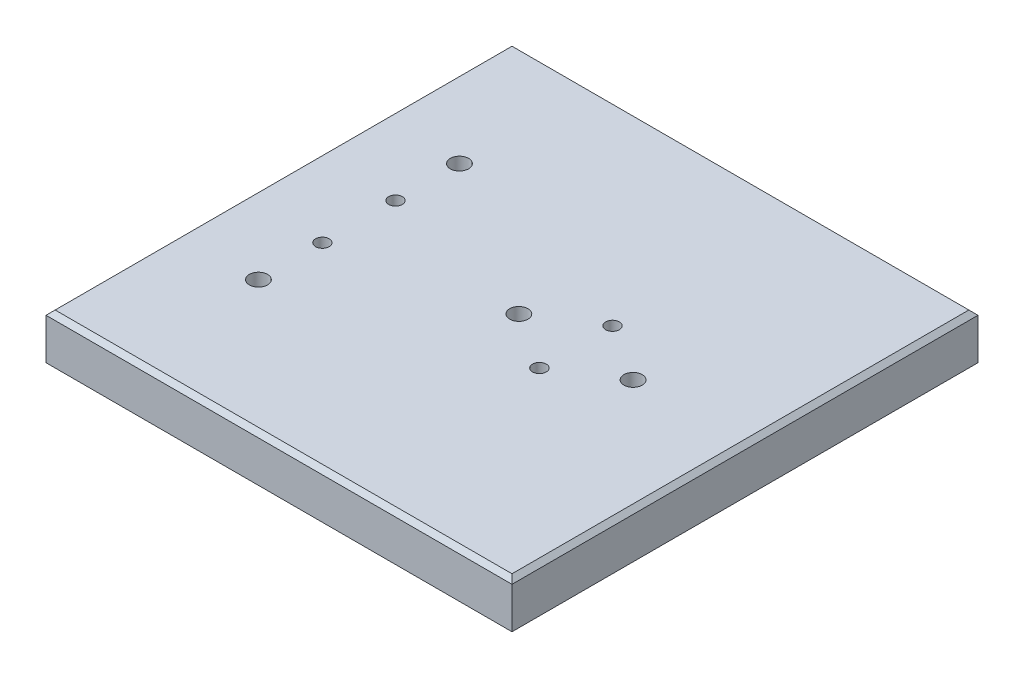
ISO-10303-21;
HEADER;
FILE_DESCRIPTION(('STEP AP214'),'2;1');
FILE_NAME('part.step','',(''),(''),'','','');
FILE_SCHEMA(('AUTOMOTIVE_DESIGN { 1 0 10303 214 1 1 1 1 }'));
ENDSEC;
DATA;
#1=APPLICATION_CONTEXT('core data for automotive mechanical design processes');
#2=APPLICATION_PROTOCOL_DEFINITION('international standard','automotive_design',2000,#1);
#3=PRODUCT_CONTEXT('',#1,'mechanical');
#4=PRODUCT('Part','Part','',(#3));
#5=PRODUCT_RELATED_PRODUCT_CATEGORY('part','',(#4));
#6=PRODUCT_DEFINITION_FORMATION('','',#4);
#7=PRODUCT_DEFINITION_CONTEXT('part definition',#1,'design');
#8=PRODUCT_DEFINITION('design','',#6,#7);
#9=PRODUCT_DEFINITION_SHAPE('','',#8);
#10=(LENGTH_UNIT() NAMED_UNIT(*) SI_UNIT(.MILLI.,.METRE.));
#11=(NAMED_UNIT(*) PLANE_ANGLE_UNIT() SI_UNIT($,.RADIAN.));
#12=(NAMED_UNIT(*) SI_UNIT($,.STERADIAN.) SOLID_ANGLE_UNIT());
#13=UNCERTAINTY_MEASURE_WITH_UNIT(LENGTH_MEASURE(1.E-05),#10,'distance_accuracy_value','');
#14=(GEOMETRIC_REPRESENTATION_CONTEXT(3) GLOBAL_UNCERTAINTY_ASSIGNED_CONTEXT((#13)) GLOBAL_UNIT_ASSIGNED_CONTEXT((#10,
#11,#12)) REPRESENTATION_CONTEXT('',''));
#15=CARTESIAN_POINT('',(0.,0.,0.));
#16=DIRECTION('',(0.,0.,1.));
#17=DIRECTION('',(1.,0.,0.));
#18=AXIS2_PLACEMENT_3D('',#15,#16,#17);
#19=CARTESIAN_POINT('',(16.5000000000007,5.,-8.));
#20=DIRECTION('',(-1.,0.,0.));
#21=DIRECTION('',(0.,0.,1.));
#22=AXIS2_PLACEMENT_3D('',#19,#20,#21);
#23=CYLINDRICAL_SURFACE('',#22,1.5);
#24=CARTESIAN_POINT('',(-41.4999999999993,5.,-8.));
#25=DIRECTION('',(-1.,0.,0.));
#26=DIRECTION('',(0.,0.,1.));
#27=AXIS2_PLACEMENT_3D('',#24,#25,#26);
#28=CIRCLE('',#27,1.5);
#29=CARTESIAN_POINT('',(-41.4999999999993,5.,-6.5));
#30=VERTEX_POINT('',#29);
#31=EDGE_CURVE('E344',#30,#30,#28,.T.);
#32=ORIENTED_EDGE('',*,*,#31,.T.);
#33=EDGE_LOOP('',(#32));
#34=FACE_BOUND('',#33,.T.);
#35=CARTESIAN_POINT('',(-33.4999999999993,5.,-8.));
#36=DIRECTION('',(-0.707106781186547,-0.707106781186548,0.));
#37=DIRECTION('',(-0.707106781186547,0.707106781186548,0.));
#38=AXIS2_PLACEMENT_3D('',#35,#36,#37);
#39=ELLIPSE('',#38,2.12132034355965,1.5);
#40=CARTESIAN_POINT('',(-33.4999999999993,5.,-9.5));
#41=VERTEX_POINT('',#40);
#42=CARTESIAN_POINT('',(-33.4999999999993,5.,-6.5));
#43=VERTEX_POINT('',#42);
#44=EDGE_CURVE('E183',#41,#43,#39,.F.);
#45=ORIENTED_EDGE('',*,*,#44,.T.);
#46=CARTESIAN_POINT('',(-33.4999999999993,5.,-8.));
#47=DIRECTION('',(-0.707106781186547,0.707106781186548,0.));
#48=DIRECTION('',(-0.707106781186547,-0.707106781186548,0.));
#49=AXIS2_PLACEMENT_3D('',#46,#47,#48);
#50=ELLIPSE('',#49,2.12132034355965,1.5);
#51=EDGE_CURVE('E194',#43,#41,#50,.F.);
#52=ORIENTED_EDGE('',*,*,#51,.T.);
#53=EDGE_LOOP('',(#45,#52));
#54=FACE_BOUND('',#53,.T.);
#55=ADVANCED_FACE('F44',(#34,#54),#23,.F.);
#56=CARTESIAN_POINT('',(16.5000000000007,5.,8.));
#57=DIRECTION('',(-1.,0.,0.));
#58=DIRECTION('',(0.,0.,1.));
#59=AXIS2_PLACEMENT_3D('',#56,#57,#58);
#60=CYLINDRICAL_SURFACE('',#59,1.5);
#61=CARTESIAN_POINT('',(-41.4999999999993,5.,8.));
#62=DIRECTION('',(-1.,0.,0.));
#63=DIRECTION('',(0.,0.,1.));
#64=AXIS2_PLACEMENT_3D('',#61,#62,#63);
#65=CIRCLE('',#64,1.5);
#66=CARTESIAN_POINT('',(-41.4999999999993,5.,9.5));
#67=VERTEX_POINT('',#66);
#68=EDGE_CURVE('E312',#67,#67,#65,.T.);
#69=ORIENTED_EDGE('',*,*,#68,.T.);
#70=EDGE_LOOP('',(#69));
#71=FACE_BOUND('',#70,.T.);
#72=CARTESIAN_POINT('',(-33.4999999999993,5.,8.));
#73=DIRECTION('',(-0.707106781186547,-0.707106781186548,0.));
#74=DIRECTION('',(-0.707106781186547,0.707106781186548,0.));
#75=AXIS2_PLACEMENT_3D('',#72,#73,#74);
#76=ELLIPSE('',#75,2.12132034355965,1.5);
#77=CARTESIAN_POINT('',(-33.4999999999993,5.,6.5));
#78=VERTEX_POINT('',#77);
#79=CARTESIAN_POINT('',(-33.4999999999993,5.,9.50000000000001));
#80=VERTEX_POINT('',#79);
#81=EDGE_CURVE('E161',#78,#80,#76,.F.);
#82=ORIENTED_EDGE('',*,*,#81,.T.);
#83=CARTESIAN_POINT('',(-33.4999999999993,5.,8.));
#84=DIRECTION('',(-0.707106781186547,0.707106781186548,0.));
#85=DIRECTION('',(-0.707106781186547,-0.707106781186548,0.));
#86=AXIS2_PLACEMENT_3D('',#83,#84,#85);
#87=ELLIPSE('',#86,2.12132034355965,1.5);
#88=EDGE_CURVE('E179',#80,#78,#87,.F.);
#89=ORIENTED_EDGE('',*,*,#88,.T.);
#90=EDGE_LOOP('',(#82,#89));
#91=FACE_BOUND('',#90,.T.);
#92=ADVANCED_FACE('F426',(#71,#91),#60,.F.);
#93=CARTESIAN_POINT('',(51.000000000001,10.,50.9999999999997));
#94=DIRECTION('',(-1.,0.,0.));
#95=DIRECTION('',(0.,0.,1.));
#96=AXIS2_PLACEMENT_3D('',#93,#94,#95);
#97=PLANE('',#96);
#98=DIRECTION('',(0.,-1.,0.));
#99=VECTOR('',#98,1.);
#100=CARTESIAN_POINT('',(51.000000000001,10.,-51.0000000000003));
#101=LINE('',#100,#99);
#102=CARTESIAN_POINT('',(51.000000000001,8.99999999999997,-51.0000000000003));
#103=VERTEX_POINT('',#102);
#104=CARTESIAN_POINT('',(51.000000000001,0.,-51.0000000000003));
#105=VERTEX_POINT('',#104);
#106=EDGE_CURVE('E157',#103,#105,#101,.T.);
#107=ORIENTED_EDGE('',*,*,#106,.F.);
#108=DIRECTION('',(0.,0.,1.));
#109=VECTOR('',#108,1.);
#110=CARTESIAN_POINT('',(51.000000000001,8.99999999999997,50.9999999999997));
#111=LINE('',#110,#109);
#112=CARTESIAN_POINT('',(51.000000000001,8.99999999999997,50.9999999999997));
#113=VERTEX_POINT('',#112);
#114=EDGE_CURVE('E55',#103,#113,#111,.T.);
#115=ORIENTED_EDGE('',*,*,#114,.T.);
#116=DIRECTION('',(0.,-1.,0.));
#117=VECTOR('',#116,1.);
#118=CARTESIAN_POINT('',(51.000000000001,10.,50.9999999999997));
#119=LINE('',#118,#117);
#120=CARTESIAN_POINT('',(51.000000000001,0.,50.9999999999997));
#121=VERTEX_POINT('',#120);
#122=EDGE_CURVE('E384',#113,#121,#119,.T.);
#123=ORIENTED_EDGE('',*,*,#122,.T.);
#124=DIRECTION('',(0.,0.,-1.));
#125=VECTOR('',#124,1.);
#126=CARTESIAN_POINT('',(51.000000000001,0.,50.9999999999997));
#127=LINE('',#126,#125);
#128=EDGE_CURVE('E357',#121,#105,#127,.T.);
#129=ORIENTED_EDGE('',*,*,#128,.T.);
#130=EDGE_LOOP('',(#107,#115,#123,#129));
#131=FACE_BOUND('',#130,.T.);
#132=ADVANCED_FACE('F399',(#131),#97,.F.);
#133=CARTESIAN_POINT('',(-50.9999999999993,10.,-51.0000000000003));
#134=DIRECTION('',(0.,0.,1.));
#135=DIRECTION('',(1.,0.,0.));
#136=AXIS2_PLACEMENT_3D('',#133,#134,#135);
#137=PLANE('',#136);
#138=DIRECTION('',(0.,-1.,0.));
#139=VECTOR('',#138,1.);
#140=CARTESIAN_POINT('',(-50.9999999999993,10.,-51.0000000000003));
#141=LINE('',#140,#139);
#142=CARTESIAN_POINT('',(-50.9999999999993,8.99999999999997,-51.0000000000003));
#143=VERTEX_POINT('',#142);
#144=CARTESIAN_POINT('',(-50.9999999999993,0.,-51.0000000000003));
#145=VERTEX_POINT('',#144);
#146=EDGE_CURVE('E389',#143,#145,#141,.T.);
#147=ORIENTED_EDGE('',*,*,#146,.F.);
#148=DIRECTION('',(1.,0.,0.));
#149=VECTOR('',#148,1.);
#150=CARTESIAN_POINT('',(-50.9999999999993,8.99999999999997,-51.0000000000003));
#151=LINE('',#150,#149);
#152=EDGE_CURVE('E73',#143,#103,#151,.T.);
#153=ORIENTED_EDGE('',*,*,#152,.T.);
#154=ORIENTED_EDGE('',*,*,#106,.T.);
#155=DIRECTION('',(-1.,0.,0.));
#156=VECTOR('',#155,1.);
#157=CARTESIAN_POINT('',(-50.9999999999993,0.,-51.0000000000003));
#158=LINE('',#157,#156);
#159=EDGE_CURVE('E372',#105,#145,#158,.T.);
#160=ORIENTED_EDGE('',*,*,#159,.T.);
#161=EDGE_LOOP('',(#147,#153,#154,#160));
#162=FACE_BOUND('',#161,.T.);
#163=ADVANCED_FACE('F393',(#162),#137,.F.);
#164=CARTESIAN_POINT('',(-50.9999999999993,10.,50.9999999999997));
#165=DIRECTION('',(1.,0.,0.));
#166=DIRECTION('',(0.,0.,-1.));
#167=AXIS2_PLACEMENT_3D('',#164,#165,#166);
#168=PLANE('',#167);
#169=CARTESIAN_POINT('',(-50.9999999999993,5.,-8.));
#170=DIRECTION('',(-1.,0.,0.));
#171=DIRECTION('',(0.,0.,1.));
#172=AXIS2_PLACEMENT_3D('',#169,#170,#171);
#173=CIRCLE('',#172,2.5);
#174=CARTESIAN_POINT('',(-50.9999999999993,5.,-5.5));
#175=VERTEX_POINT('',#174);
#176=EDGE_CURVE('E358',#175,#175,#173,.T.);
#177=ORIENTED_EDGE('',*,*,#176,.F.);
#178=EDGE_LOOP('',(#177));
#179=FACE_BOUND('',#178,.T.);
#180=CARTESIAN_POINT('',(-50.9999999999993,5.,8.));
#181=DIRECTION('',(-1.,0.,0.));
#182=DIRECTION('',(0.,0.,1.));
#183=AXIS2_PLACEMENT_3D('',#180,#181,#182);
#184=CIRCLE('',#183,2.5);
#185=CARTESIAN_POINT('',(-50.9999999999993,5.,10.5));
#186=VERTEX_POINT('',#185);
#187=EDGE_CURVE('E343',#186,#186,#184,.T.);
#188=ORIENTED_EDGE('',*,*,#187,.F.);
#189=EDGE_LOOP('',(#188));
#190=FACE_BOUND('',#189,.T.);
#191=DIRECTION('',(0.,-1.,0.));
#192=VECTOR('',#191,1.);
#193=CARTESIAN_POINT('',(-50.9999999999993,10.,50.9999999999997));
#194=LINE('',#193,#192);
#195=CARTESIAN_POINT('',(-50.9999999999993,8.99999999999997,50.9999999999997));
#196=VERTEX_POINT('',#195);
#197=CARTESIAN_POINT('',(-50.9999999999993,0.,50.9999999999997));
#198=VERTEX_POINT('',#197);
#199=EDGE_CURVE('E386',#196,#198,#194,.T.);
#200=ORIENTED_EDGE('',*,*,#199,.F.);
#201=DIRECTION('',(0.,0.,-1.));
#202=VECTOR('',#201,1.);
#203=CARTESIAN_POINT('',(-50.9999999999993,8.99999999999997,50.9999999999997));
#204=LINE('',#203,#202);
#205=EDGE_CURVE('E226',#196,#143,#204,.T.);
#206=ORIENTED_EDGE('',*,*,#205,.T.);
#207=ORIENTED_EDGE('',*,*,#146,.T.);
#208=DIRECTION('',(0.,0.,1.));
#209=VECTOR('',#208,1.);
#210=CARTESIAN_POINT('',(-50.9999999999993,0.,50.9999999999997));
#211=LINE('',#210,#209);
#212=EDGE_CURVE('E376',#145,#198,#211,.T.);
#213=ORIENTED_EDGE('',*,*,#212,.T.);
#214=EDGE_LOOP('',(#200,#206,#207,#213));
#215=FACE_BOUND('',#214,.T.);
#216=ADVANCED_FACE('F405',(#179,#190,#215),#168,.F.);
#217=CARTESIAN_POINT('',(-50.9999999999993,10.,50.9999999999997));
#218=DIRECTION('',(0.,0.,-1.));
#219=DIRECTION('',(-1.,0.,0.));
#220=AXIS2_PLACEMENT_3D('',#217,#218,#219);
#221=PLANE('',#220);
#222=ORIENTED_EDGE('',*,*,#122,.F.);
#223=DIRECTION('',(-1.,0.,0.));
#224=VECTOR('',#223,1.);
#225=CARTESIAN_POINT('',(-50.9999999999993,8.99999999999997,50.9999999999997));
#226=LINE('',#225,#224);
#227=EDGE_CURVE('E11',#113,#196,#226,.T.);
#228=ORIENTED_EDGE('',*,*,#227,.T.);
#229=ORIENTED_EDGE('',*,*,#199,.T.);
#230=DIRECTION('',(1.,0.,0.));
#231=VECTOR('',#230,1.);
#232=CARTESIAN_POINT('',(-50.9999999999993,0.,50.9999999999997));
#233=LINE('',#232,#231);
#234=EDGE_CURVE('E380',#198,#121,#233,.T.);
#235=ORIENTED_EDGE('',*,*,#234,.T.);
#236=EDGE_LOOP('',(#222,#228,#229,#235));
#237=FACE_BOUND('',#236,.T.);
#238=ADVANCED_FACE('F401',(#237),#221,.F.);
#239=CARTESIAN_POINT('',(0.,10.,0.));
#240=DIRECTION('',(0.,-1.,0.));
#241=DIRECTION('',(0.,0.,-1.));
#242=AXIS2_PLACEMENT_3D('',#239,#240,#241);
#243=PLANE('',#242);
#244=DIRECTION('',(-1.,0.,0.));
#245=VECTOR('',#244,1.);
#246=CARTESIAN_POINT('',(0.,10.,-50.0000000000003));
#247=LINE('',#246,#245);
#248=CARTESIAN_POINT('',(50.000000000001,10.,-50.0000000000003));
#249=VERTEX_POINT('',#248);
#250=CARTESIAN_POINT('',(-49.9999999999993,10.,-50.0000000000003));
#251=VERTEX_POINT('',#250);
#252=EDGE_CURVE('E219',#249,#251,#247,.T.);
#253=ORIENTED_EDGE('',*,*,#252,.T.);
#254=DIRECTION('',(0.,0.,1.));
#255=VECTOR('',#254,1.);
#256=CARTESIAN_POINT('',(-49.9999999999993,10.,0.));
#257=LINE('',#256,#255);
#258=CARTESIAN_POINT('',(-49.9999999999993,10.,49.9999999999997));
#259=VERTEX_POINT('',#258);
#260=EDGE_CURVE('E222',#251,#259,#257,.T.);
#261=ORIENTED_EDGE('',*,*,#260,.T.);
#262=DIRECTION('',(1.,0.,0.));
#263=VECTOR('',#262,1.);
#264=CARTESIAN_POINT('',(0.,10.,49.9999999999997));
#265=LINE('',#264,#263);
#266=CARTESIAN_POINT('',(50.000000000001,10.,49.9999999999997));
#267=VERTEX_POINT('',#266);
#268=EDGE_CURVE('E213',#259,#267,#265,.T.);
#269=ORIENTED_EDGE('',*,*,#268,.T.);
#270=DIRECTION('',(0.,0.,-1.));
#271=VECTOR('',#270,1.);
#272=CARTESIAN_POINT('',(50.000000000001,10.,0.));
#273=LINE('',#272,#271);
#274=EDGE_CURVE('E216',#267,#249,#273,.T.);
#275=ORIENTED_EDGE('',*,*,#274,.T.);
#276=EDGE_LOOP('',(#253,#261,#269,#275));
#277=FACE_BOUND('',#276,.T.);
#278=CARTESIAN_POINT('',(-33.4999999999993,10.,8.));
#279=DIRECTION('',(0.,1.,0.));
#280=DIRECTION('',(0.,0.,-1.));
#281=AXIS2_PLACEMENT_3D('',#278,#279,#280);
#282=CIRCLE('',#281,1.5);
#283=CARTESIAN_POINT('',(-33.4999999999993,10.,6.5));
#284=VERTEX_POINT('',#283);
#285=EDGE_CURVE('E247',#284,#284,#282,.T.);
#286=ORIENTED_EDGE('',*,*,#285,.F.);
#287=EDGE_LOOP('',(#286));
#288=FACE_BOUND('',#287,.T.);
#289=CARTESIAN_POINT('',(14.0000000000007,10.,7.99999999999999));
#290=DIRECTION('',(0.,1.,0.));
#291=DIRECTION('',(0.,0.,1.));
#292=AXIS2_PLACEMENT_3D('',#289,#290,#291);
#293=CIRCLE('',#292,1.5);
#294=CARTESIAN_POINT('',(14.0000000000007,10.,9.5));
#295=VERTEX_POINT('',#294);
#296=EDGE_CURVE('E263',#295,#295,#293,.T.);
#297=ORIENTED_EDGE('',*,*,#296,.F.);
#298=EDGE_LOOP('',(#297));
#299=FACE_BOUND('',#298,.T.);
#300=CARTESIAN_POINT('',(14.0000000000007,10.,-8.));
#301=DIRECTION('',(0.,1.,0.));
#302=DIRECTION('',(0.,0.,1.));
#303=AXIS2_PLACEMENT_3D('',#300,#301,#302);
#304=CIRCLE('',#303,1.5);
#305=CARTESIAN_POINT('',(14.0000000000007,10.,-6.49999999999999));
#306=VERTEX_POINT('',#305);
#307=EDGE_CURVE('E552',#306,#306,#304,.T.);
#308=ORIENTED_EDGE('',*,*,#307,.F.);
#309=EDGE_LOOP('',(#308));
#310=FACE_BOUND('',#309,.T.);
#311=CARTESIAN_POINT('',(-33.4999999999993,10.,-8.));
#312=DIRECTION('',(0.,1.,0.));
#313=DIRECTION('',(0.,0.,1.));
#314=AXIS2_PLACEMENT_3D('',#311,#312,#313);
#315=CIRCLE('',#314,1.5);
#316=CARTESIAN_POINT('',(-33.4999999999993,10.,-6.49999999999999));
#317=VERTEX_POINT('',#316);
#318=EDGE_CURVE('E271',#317,#317,#315,.T.);
#319=ORIENTED_EDGE('',*,*,#318,.F.);
#320=EDGE_LOOP('',(#319));
#321=FACE_BOUND('',#320,.T.);
#322=CARTESIAN_POINT('',(-33.4999999999993,10.,22.));
#323=DIRECTION('',(0.,-1.,0.));
#324=DIRECTION('',(0.,0.,-1.));
#325=AXIS2_PLACEMENT_3D('',#322,#323,#324);
#326=CIRCLE('',#325,2.);
#327=CARTESIAN_POINT('',(-33.4999999999993,10.,20.));
#328=VERTEX_POINT('',#327);
#329=EDGE_CURVE('E276',#328,#328,#326,.T.);
#330=ORIENTED_EDGE('',*,*,#329,.T.);
#331=EDGE_LOOP('',(#330));
#332=FACE_BOUND('',#331,.T.);
#333=CARTESIAN_POINT('',(1.50000000000073,10.,0.));
#334=DIRECTION('',(0.,-1.,0.));
#335=DIRECTION('',(0.,0.,-1.));
#336=AXIS2_PLACEMENT_3D('',#333,#334,#335);
#337=CIRCLE('',#336,2.);
#338=CARTESIAN_POINT('',(1.50000000000073,10.,-1.99999999999999));
#339=VERTEX_POINT('',#338);
#340=EDGE_CURVE('E285',#339,#339,#337,.T.);
#341=ORIENTED_EDGE('',*,*,#340,.T.);
#342=EDGE_LOOP('',(#341));
#343=FACE_BOUND('',#342,.T.);
#344=CARTESIAN_POINT('',(26.5000000000007,10.,0.));
#345=DIRECTION('',(0.,-1.,0.));
#346=DIRECTION('',(0.,0.,-1.));
#347=AXIS2_PLACEMENT_3D('',#344,#345,#346);
#348=CIRCLE('',#347,2.);
#349=CARTESIAN_POINT('',(26.5000000000007,10.,-1.99999999999999));
#350=VERTEX_POINT('',#349);
#351=EDGE_CURVE('E293',#350,#350,#348,.T.);
#352=ORIENTED_EDGE('',*,*,#351,.T.);
#353=EDGE_LOOP('',(#352));
#354=FACE_BOUND('',#353,.T.);
#355=CARTESIAN_POINT('',(-33.4999999999993,10.,-22.));
#356=DIRECTION('',(0.,-1.,0.));
#357=DIRECTION('',(0.,0.,-1.));
#358=AXIS2_PLACEMENT_3D('',#355,#356,#357);
#359=CIRCLE('',#358,2.);
#360=CARTESIAN_POINT('',(-33.4999999999993,10.,-24.));
#361=VERTEX_POINT('',#360);
#362=EDGE_CURVE('E301',#361,#361,#359,.T.);
#363=ORIENTED_EDGE('',*,*,#362,.T.);
#364=EDGE_LOOP('',(#363));
#365=FACE_BOUND('',#364,.T.);
#366=ADVANCED_FACE('F414',(#277,#288,#299,#310,#321,#332,#343,#354,#365),#243,.F.);
#367=CARTESIAN_POINT('',(0.,0.,0.));
#368=DIRECTION('',(0.,-1.,0.));
#369=DIRECTION('',(0.,0.,-1.));
#370=AXIS2_PLACEMENT_3D('',#367,#368,#369);
#371=PLANE('',#370);
#372=CARTESIAN_POINT('',(-33.4999999999993,0.,22.));
#373=DIRECTION('',(0.,-1.,0.));
#374=DIRECTION('',(0.,0.,-1.));
#375=AXIS2_PLACEMENT_3D('',#372,#373,#374);
#376=CIRCLE('',#375,3.5);
#377=CARTESIAN_POINT('',(-33.4999999999993,0.,18.5));
#378=VERTEX_POINT('',#377);
#379=EDGE_CURVE('E313',#378,#378,#376,.T.);
#380=ORIENTED_EDGE('',*,*,#379,.F.);
#381=EDGE_LOOP('',(#380));
#382=FACE_BOUND('',#381,.T.);
#383=CARTESIAN_POINT('',(-33.4999999999993,0.,-22.));
#384=DIRECTION('',(0.,-1.,0.));
#385=DIRECTION('',(0.,0.,-1.));
#386=AXIS2_PLACEMENT_3D('',#383,#384,#385);
#387=CIRCLE('',#386,3.5);
#388=CARTESIAN_POINT('',(-33.4999999999993,0.,-25.5));
#389=VERTEX_POINT('',#388);
#390=EDGE_CURVE('E321',#389,#389,#387,.T.);
#391=ORIENTED_EDGE('',*,*,#390,.F.);
#392=EDGE_LOOP('',(#391));
#393=FACE_BOUND('',#392,.T.);
#394=CARTESIAN_POINT('',(1.50000000000073,0.,0.));
#395=DIRECTION('',(0.,-1.,0.));
#396=DIRECTION('',(0.,0.,-1.));
#397=AXIS2_PLACEMENT_3D('',#394,#395,#396);
#398=CIRCLE('',#397,3.5);
#399=CARTESIAN_POINT('',(1.50000000000073,0.,-3.49999999999999));
#400=VERTEX_POINT('',#399);
#401=EDGE_CURVE('E329',#400,#400,#398,.T.);
#402=ORIENTED_EDGE('',*,*,#401,.F.);
#403=EDGE_LOOP('',(#402));
#404=FACE_BOUND('',#403,.T.);
#405=CARTESIAN_POINT('',(26.5000000000007,0.,0.));
#406=DIRECTION('',(0.,-1.,0.));
#407=DIRECTION('',(0.,0.,-1.));
#408=AXIS2_PLACEMENT_3D('',#405,#406,#407);
#409=CIRCLE('',#408,3.5);
#410=CARTESIAN_POINT('',(26.5000000000007,0.,-3.49999999999999));
#411=VERTEX_POINT('',#410);
#412=EDGE_CURVE('E280',#411,#411,#409,.T.);
#413=ORIENTED_EDGE('',*,*,#412,.F.);
#414=EDGE_LOOP('',(#413));
#415=FACE_BOUND('',#414,.T.);
#416=ORIENTED_EDGE('',*,*,#128,.F.);
#417=ORIENTED_EDGE('',*,*,#234,.F.);
#418=ORIENTED_EDGE('',*,*,#212,.F.);
#419=ORIENTED_EDGE('',*,*,#159,.F.);
#420=EDGE_LOOP('',(#416,#417,#418,#419));
#421=FACE_BOUND('',#420,.T.);
#422=ADVANCED_FACE('F397',(#382,#393,#404,#415,#421),#371,.T.);
#423=CARTESIAN_POINT('',(-41.4999999999993,5.,8.));
#424=DIRECTION('',(-1.,0.,0.));
#425=DIRECTION('',(0.,0.,1.));
#426=AXIS2_PLACEMENT_3D('',#423,#424,#425);
#427=CYLINDRICAL_SURFACE('',#426,2.5);
#428=CARTESIAN_POINT('',(-41.4999999999993,5.,8.));
#429=DIRECTION('',(-1.,0.,0.));
#430=DIRECTION('',(0.,0.,1.));
#431=AXIS2_PLACEMENT_3D('',#428,#429,#430);
#432=CIRCLE('',#431,2.5);
#433=CARTESIAN_POINT('',(-41.4999999999993,5.,10.5));
#434=VERTEX_POINT('',#433);
#435=EDGE_CURVE('E362',#434,#434,#432,.T.);
#436=ORIENTED_EDGE('',*,*,#435,.F.);
#437=EDGE_LOOP('',(#436));
#438=FACE_BOUND('',#437,.T.);
#439=ORIENTED_EDGE('',*,*,#187,.T.);
#440=EDGE_LOOP('',(#439));
#441=FACE_BOUND('',#440,.T.);
#442=ADVANCED_FACE('F589',(#438,#441),#427,.F.);
#443=CARTESIAN_POINT('',(-41.4999999999993,5.,8.));
#444=DIRECTION('',(-1.,0.,0.));
#445=DIRECTION('',(0.,0.,1.));
#446=AXIS2_PLACEMENT_3D('',#443,#444,#445);
#447=PLANE('',#446);
#448=ORIENTED_EDGE('',*,*,#68,.F.);
#449=EDGE_LOOP('',(#448));
#450=FACE_BOUND('',#449,.T.);
#451=ORIENTED_EDGE('',*,*,#435,.T.);
#452=EDGE_LOOP('',(#451));
#453=FACE_BOUND('',#452,.T.);
#454=ADVANCED_FACE('F600',(#450,#453),#447,.T.);
#455=CARTESIAN_POINT('',(-41.4999999999993,5.,-8.));
#456=DIRECTION('',(-1.,0.,0.));
#457=DIRECTION('',(0.,0.,1.));
#458=AXIS2_PLACEMENT_3D('',#455,#456,#457);
#459=CYLINDRICAL_SURFACE('',#458,2.5);
#460=CARTESIAN_POINT('',(-41.4999999999993,5.,-8.));
#461=DIRECTION('',(-1.,0.,0.));
#462=DIRECTION('',(0.,0.,1.));
#463=AXIS2_PLACEMENT_3D('',#460,#461,#462);
#464=CIRCLE('',#463,2.5);
#465=CARTESIAN_POINT('',(-41.4999999999993,5.,-5.5));
#466=VERTEX_POINT('',#465);
#467=EDGE_CURVE('E354',#466,#466,#464,.T.);
#468=ORIENTED_EDGE('',*,*,#467,.F.);
#469=EDGE_LOOP('',(#468));
#470=FACE_BOUND('',#469,.T.);
#471=ORIENTED_EDGE('',*,*,#176,.T.);
#472=EDGE_LOOP('',(#471));
#473=FACE_BOUND('',#472,.T.);
#474=ADVANCED_FACE('F902',(#470,#473),#459,.F.);
#475=CARTESIAN_POINT('',(-41.4999999999993,5.,-8.));
#476=DIRECTION('',(-1.,0.,0.));
#477=DIRECTION('',(0.,0.,1.));
#478=AXIS2_PLACEMENT_3D('',#475,#476,#477);
#479=PLANE('',#478);
#480=ORIENTED_EDGE('',*,*,#31,.F.);
#481=EDGE_LOOP('',(#480));
#482=FACE_BOUND('',#481,.T.);
#483=ORIENTED_EDGE('',*,*,#467,.T.);
#484=EDGE_LOOP('',(#483));
#485=FACE_BOUND('',#484,.T.);
#486=ADVANCED_FACE('F477',(#482,#485),#479,.T.);
#487=CARTESIAN_POINT('',(26.5000000000007,5.,0.));
#488=DIRECTION('',(0.,-1.,0.));
#489=DIRECTION('',(0.,0.,-1.));
#490=AXIS2_PLACEMENT_3D('',#487,#488,#489);
#491=CYLINDRICAL_SURFACE('',#490,3.5);
#492=CARTESIAN_POINT('',(26.5000000000007,5.,0.));
#493=DIRECTION('',(0.,-1.,0.));
#494=DIRECTION('',(0.,0.,-1.));
#495=AXIS2_PLACEMENT_3D('',#492,#493,#494);
#496=CIRCLE('',#495,3.5);
#497=CARTESIAN_POINT('',(26.5000000000007,5.,-3.49999999999999));
#498=VERTEX_POINT('',#497);
#499=EDGE_CURVE('E333',#498,#498,#496,.T.);
#500=ORIENTED_EDGE('',*,*,#499,.F.);
#501=EDGE_LOOP('',(#500));
#502=FACE_BOUND('',#501,.T.);
#503=ORIENTED_EDGE('',*,*,#412,.T.);
#504=EDGE_LOOP('',(#503));
#505=FACE_BOUND('',#504,.T.);
#506=ADVANCED_FACE('F473',(#502,#505),#491,.F.);
#507=CARTESIAN_POINT('',(26.5000000000007,5.,0.));
#508=DIRECTION('',(0.,-1.,0.));
#509=DIRECTION('',(0.,0.,-1.));
#510=AXIS2_PLACEMENT_3D('',#507,#508,#509);
#511=PLANE('',#510);
#512=CARTESIAN_POINT('',(26.5000000000007,5.,0.));
#513=DIRECTION('',(0.,-1.,0.));
#514=DIRECTION('',(0.,0.,-1.));
#515=AXIS2_PLACEMENT_3D('',#512,#513,#514);
#516=CIRCLE('',#515,2.);
#517=CARTESIAN_POINT('',(26.5000000000007,5.,-1.99999999999999));
#518=VERTEX_POINT('',#517);
#519=EDGE_CURVE('E297',#518,#518,#516,.T.);
#520=ORIENTED_EDGE('',*,*,#519,.F.);
#521=EDGE_LOOP('',(#520));
#522=FACE_BOUND('',#521,.T.);
#523=ORIENTED_EDGE('',*,*,#499,.T.);
#524=EDGE_LOOP('',(#523));
#525=FACE_BOUND('',#524,.T.);
#526=ADVANCED_FACE('F476',(#522,#525),#511,.T.);
#527=CARTESIAN_POINT('',(1.50000000000073,5.,0.));
#528=DIRECTION('',(0.,-1.,0.));
#529=DIRECTION('',(0.,0.,-1.));
#530=AXIS2_PLACEMENT_3D('',#527,#528,#529);
#531=CYLINDRICAL_SURFACE('',#530,3.5);
#532=CARTESIAN_POINT('',(1.50000000000073,5.,0.));
#533=DIRECTION('',(0.,-1.,0.));
#534=DIRECTION('',(0.,0.,-1.));
#535=AXIS2_PLACEMENT_3D('',#532,#533,#534);
#536=CIRCLE('',#535,3.5);
#537=CARTESIAN_POINT('',(1.50000000000073,5.,-3.49999999999999));
#538=VERTEX_POINT('',#537);
#539=EDGE_CURVE('E325',#538,#538,#536,.T.);
#540=ORIENTED_EDGE('',*,*,#539,.F.);
#541=EDGE_LOOP('',(#540));
#542=FACE_BOUND('',#541,.T.);
#543=ORIENTED_EDGE('',*,*,#401,.T.);
#544=EDGE_LOOP('',(#543));
#545=FACE_BOUND('',#544,.T.);
#546=ADVANCED_FACE('F481',(#542,#545),#531,.F.);
#547=CARTESIAN_POINT('',(1.50000000000073,5.,0.));
#548=DIRECTION('',(0.,-1.,0.));
#549=DIRECTION('',(0.,0.,-1.));
#550=AXIS2_PLACEMENT_3D('',#547,#548,#549);
#551=PLANE('',#550);
#552=CARTESIAN_POINT('',(1.50000000000073,5.,0.));
#553=DIRECTION('',(0.,-1.,0.));
#554=DIRECTION('',(0.,0.,-1.));
#555=AXIS2_PLACEMENT_3D('',#552,#553,#554);
#556=CIRCLE('',#555,2.);
#557=CARTESIAN_POINT('',(1.50000000000073,5.,-1.99999999999999));
#558=VERTEX_POINT('',#557);
#559=EDGE_CURVE('E289',#558,#558,#556,.T.);
#560=ORIENTED_EDGE('',*,*,#559,.F.);
#561=EDGE_LOOP('',(#560));
#562=FACE_BOUND('',#561,.T.);
#563=ORIENTED_EDGE('',*,*,#539,.T.);
#564=EDGE_LOOP('',(#563));
#565=FACE_BOUND('',#564,.T.);
#566=ADVANCED_FACE('F485',(#562,#565),#551,.T.);
#567=CARTESIAN_POINT('',(-33.4999999999993,5.,-22.));
#568=DIRECTION('',(0.,-1.,0.));
#569=DIRECTION('',(0.,0.,-1.));
#570=AXIS2_PLACEMENT_3D('',#567,#568,#569);
#571=CYLINDRICAL_SURFACE('',#570,3.5);
#572=CARTESIAN_POINT('',(-33.4999999999993,5.,-22.));
#573=DIRECTION('',(0.,-1.,0.));
#574=DIRECTION('',(0.,0.,-1.));
#575=AXIS2_PLACEMENT_3D('',#572,#573,#574);
#576=CIRCLE('',#575,3.5);
#577=CARTESIAN_POINT('',(-33.4999999999993,5.,-25.5));
#578=VERTEX_POINT('',#577);
#579=EDGE_CURVE('E317',#578,#578,#576,.T.);
#580=ORIENTED_EDGE('',*,*,#579,.F.);
#581=EDGE_LOOP('',(#580));
#582=FACE_BOUND('',#581,.T.);
#583=ORIENTED_EDGE('',*,*,#390,.T.);
#584=EDGE_LOOP('',(#583));
#585=FACE_BOUND('',#584,.T.);
#586=ADVANCED_FACE('F489',(#582,#585),#571,.F.);
#587=CARTESIAN_POINT('',(-33.4999999999993,5.,-22.));
#588=DIRECTION('',(0.,-1.,0.));
#589=DIRECTION('',(0.,0.,-1.));
#590=AXIS2_PLACEMENT_3D('',#587,#588,#589);
#591=PLANE('',#590);
#592=CARTESIAN_POINT('',(-33.4999999999993,5.,-22.));
#593=DIRECTION('',(0.,-1.,0.));
#594=DIRECTION('',(0.,0.,-1.));
#595=AXIS2_PLACEMENT_3D('',#592,#593,#594);
#596=CIRCLE('',#595,2.);
#597=CARTESIAN_POINT('',(-33.4999999999993,5.,-24.));
#598=VERTEX_POINT('',#597);
#599=EDGE_CURVE('E270',#598,#598,#596,.T.);
#600=ORIENTED_EDGE('',*,*,#599,.F.);
#601=EDGE_LOOP('',(#600));
#602=FACE_BOUND('',#601,.T.);
#603=ORIENTED_EDGE('',*,*,#579,.T.);
#604=EDGE_LOOP('',(#603));
#605=FACE_BOUND('',#604,.T.);
#606=ADVANCED_FACE('F493',(#602,#605),#591,.T.);
#607=CARTESIAN_POINT('',(-33.4999999999993,5.,22.));
#608=DIRECTION('',(0.,-1.,0.));
#609=DIRECTION('',(0.,0.,-1.));
#610=AXIS2_PLACEMENT_3D('',#607,#608,#609);
#611=CYLINDRICAL_SURFACE('',#610,3.5);
#612=CARTESIAN_POINT('',(-33.4999999999993,5.,22.));
#613=DIRECTION('',(0.,-1.,0.));
#614=DIRECTION('',(0.,0.,-1.));
#615=AXIS2_PLACEMENT_3D('',#612,#613,#614);
#616=CIRCLE('',#615,3.5);
#617=CARTESIAN_POINT('',(-33.4999999999993,5.,18.5));
#618=VERTEX_POINT('',#617);
#619=EDGE_CURVE('E308',#618,#618,#616,.T.);
#620=ORIENTED_EDGE('',*,*,#619,.F.);
#621=EDGE_LOOP('',(#620));
#622=FACE_BOUND('',#621,.T.);
#623=ORIENTED_EDGE('',*,*,#379,.T.);
#624=EDGE_LOOP('',(#623));
#625=FACE_BOUND('',#624,.T.);
#626=ADVANCED_FACE('F497',(#622,#625),#611,.F.);
#627=CARTESIAN_POINT('',(-33.4999999999993,5.,22.));
#628=DIRECTION('',(0.,-1.,0.));
#629=DIRECTION('',(0.,0.,-1.));
#630=AXIS2_PLACEMENT_3D('',#627,#628,#629);
#631=PLANE('',#630);
#632=CARTESIAN_POINT('',(-33.4999999999993,5.,22.));
#633=DIRECTION('',(0.,-1.,0.));
#634=DIRECTION('',(0.,0.,-1.));
#635=AXIS2_PLACEMENT_3D('',#632,#633,#634);
#636=CIRCLE('',#635,2.);
#637=CARTESIAN_POINT('',(-33.4999999999993,5.,20.));
#638=VERTEX_POINT('',#637);
#639=EDGE_CURVE('E281',#638,#638,#636,.T.);
#640=ORIENTED_EDGE('',*,*,#639,.F.);
#641=EDGE_LOOP('',(#640));
#642=FACE_BOUND('',#641,.T.);
#643=ORIENTED_EDGE('',*,*,#619,.T.);
#644=EDGE_LOOP('',(#643));
#645=FACE_BOUND('',#644,.T.);
#646=ADVANCED_FACE('F501',(#642,#645),#631,.T.);
#647=CARTESIAN_POINT('',(-33.4999999999993,10.,-22.));
#648=DIRECTION('',(0.,-1.,0.));
#649=DIRECTION('',(0.,0.,-1.));
#650=AXIS2_PLACEMENT_3D('',#647,#648,#649);
#651=CYLINDRICAL_SURFACE('',#650,2.);
#652=ORIENTED_EDGE('',*,*,#362,.F.);
#653=EDGE_LOOP('',(#652));
#654=FACE_BOUND('',#653,.T.);
#655=ORIENTED_EDGE('',*,*,#599,.T.);
#656=EDGE_LOOP('',(#655));
#657=FACE_BOUND('',#656,.T.);
#658=ADVANCED_FACE('F505',(#654,#657),#651,.F.);
#659=CARTESIAN_POINT('',(26.5000000000007,10.,0.));
#660=DIRECTION('',(0.,-1.,0.));
#661=DIRECTION('',(0.,0.,-1.));
#662=AXIS2_PLACEMENT_3D('',#659,#660,#661);
#663=CYLINDRICAL_SURFACE('',#662,2.);
#664=ORIENTED_EDGE('',*,*,#351,.F.);
#665=EDGE_LOOP('',(#664));
#666=FACE_BOUND('',#665,.T.);
#667=ORIENTED_EDGE('',*,*,#519,.T.);
#668=EDGE_LOOP('',(#667));
#669=FACE_BOUND('',#668,.T.);
#670=ADVANCED_FACE('F509',(#666,#669),#663,.F.);
#671=CARTESIAN_POINT('',(1.50000000000073,10.,0.));
#672=DIRECTION('',(0.,-1.,0.));
#673=DIRECTION('',(0.,0.,-1.));
#674=AXIS2_PLACEMENT_3D('',#671,#672,#673);
#675=CYLINDRICAL_SURFACE('',#674,2.);
#676=ORIENTED_EDGE('',*,*,#340,.F.);
#677=EDGE_LOOP('',(#676));
#678=FACE_BOUND('',#677,.T.);
#679=ORIENTED_EDGE('',*,*,#559,.T.);
#680=EDGE_LOOP('',(#679));
#681=FACE_BOUND('',#680,.T.);
#682=ADVANCED_FACE('F513',(#678,#681),#675,.F.);
#683=CARTESIAN_POINT('',(-33.4999999999993,10.,22.));
#684=DIRECTION('',(0.,-1.,0.));
#685=DIRECTION('',(0.,0.,-1.));
#686=AXIS2_PLACEMENT_3D('',#683,#684,#685);
#687=CYLINDRICAL_SURFACE('',#686,2.);
#688=ORIENTED_EDGE('',*,*,#329,.F.);
#689=EDGE_LOOP('',(#688));
#690=FACE_BOUND('',#689,.T.);
#691=ORIENTED_EDGE('',*,*,#639,.T.);
#692=EDGE_LOOP('',(#691));
#693=FACE_BOUND('',#692,.T.);
#694=ADVANCED_FACE('F517',(#690,#693),#687,.F.);
#695=CARTESIAN_POINT('',(14.0000000000007,2.,7.99999999999999));
#696=DIRECTION('',(0.,1.,0.));
#697=DIRECTION('',(0.,0.,1.));
#698=AXIS2_PLACEMENT_3D('',#695,#696,#697);
#699=CYLINDRICAL_SURFACE('',#698,1.5);
#700=ORIENTED_EDGE('',*,*,#296,.T.);
#701=EDGE_LOOP('',(#700));
#702=FACE_BOUND('',#701,.T.);
#703=CARTESIAN_POINT('',(14.0000000000007,5.,8.));
#704=DIRECTION('',(-0.707106781186547,-0.707106781186548,0.));
#705=DIRECTION('',(-0.707106781186547,0.707106781186548,0.));
#706=AXIS2_PLACEMENT_3D('',#703,#704,#705);
#707=ELLIPSE('',#706,2.12132034355965,1.5);
#708=CARTESIAN_POINT('',(14.0000000000007,5.,6.49999999999999));
#709=VERTEX_POINT('',#708);
#710=CARTESIAN_POINT('',(14.0000000000007,5.,9.5));
#711=VERTEX_POINT('',#710);
#712=EDGE_CURVE('E150',#709,#711,#707,.F.);
#713=ORIENTED_EDGE('',*,*,#712,.F.);
#714=CARTESIAN_POINT('',(14.0000000000007,5.,8.));
#715=DIRECTION('',(-0.707106781186547,0.707106781186548,0.));
#716=DIRECTION('',(-0.707106781186547,-0.707106781186548,0.));
#717=AXIS2_PLACEMENT_3D('',#714,#715,#716);
#718=ELLIPSE('',#717,2.12132034355965,1.5);
#719=EDGE_CURVE('E149',#711,#709,#718,.T.);
#720=ORIENTED_EDGE('',*,*,#719,.F.);
#721=EDGE_LOOP('',(#713,#720));
#722=FACE_BOUND('',#721,.T.);
#723=ADVANCED_FACE('F154',(#702,#722),#699,.F.);
#724=CARTESIAN_POINT('',(16.5000000000007,5.,8.));
#725=DIRECTION('',(-1.,0.,0.));
#726=DIRECTION('',(0.,0.,1.));
#727=AXIS2_PLACEMENT_3D('',#724,#725,#726);
#728=PLANE('',#727);
#729=CARTESIAN_POINT('',(16.5000000000007,5.,8.));
#730=DIRECTION('',(-1.,0.,0.));
#731=DIRECTION('',(0.,0.,1.));
#732=AXIS2_PLACEMENT_3D('',#729,#730,#731);
#733=CIRCLE('',#732,1.5);
#734=CARTESIAN_POINT('',(16.5000000000007,5.,9.5));
#735=VERTEX_POINT('',#734);
#736=EDGE_CURVE('E348',#735,#735,#733,.T.);
#737=ORIENTED_EDGE('',*,*,#736,.T.);
#738=EDGE_LOOP('',(#737));
#739=FACE_BOUND('',#738,.T.);
#740=ADVANCED_FACE('F729',(#739),#728,.T.);
#741=CARTESIAN_POINT('',(14.0000000000007,5.,8.));
#742=DIRECTION('',(-0.707106781186547,-0.707106781186548,0.));
#743=DIRECTION('',(-0.707106781186547,0.707106781186548,0.));
#744=AXIS2_PLACEMENT_3D('',#741,#742,#743);
#745=ELLIPSE('',#744,2.12132034355965,1.5);
#746=EDGE_CURVE('E141',#709,#711,#745,.T.);
#747=ORIENTED_EDGE('',*,*,#746,.T.);
#748=ORIENTED_EDGE('',*,*,#719,.T.);
#749=EDGE_LOOP('',(#747,#748));
#750=FACE_BOUND('',#749,.T.);
#751=ORIENTED_EDGE('',*,*,#736,.F.);
#752=EDGE_LOOP('',(#751));
#753=FACE_BOUND('',#752,.T.);
#754=ADVANCED_FACE('F163',(#750,#753),#60,.F.);
#755=CARTESIAN_POINT('',(14.0000000000007,2.,7.99999999999999));
#756=DIRECTION('',(0.,1.,0.));
#757=DIRECTION('',(0.,0.,1.));
#758=AXIS2_PLACEMENT_3D('',#755,#756,#757);
#759=CIRCLE('',#758,1.5);
#760=CARTESIAN_POINT('',(14.0000000000007,2.,9.5));
#761=VERTEX_POINT('',#760);
#762=EDGE_CURVE('E556',#761,#761,#759,.T.);
#763=ORIENTED_EDGE('',*,*,#762,.F.);
#764=EDGE_LOOP('',(#763));
#765=FACE_BOUND('',#764,.T.);
#766=ORIENTED_EDGE('',*,*,#746,.F.);
#767=CARTESIAN_POINT('',(14.0000000000007,5.,8.));
#768=DIRECTION('',(-0.707106781186547,0.707106781186548,0.));
#769=DIRECTION('',(-0.707106781186547,-0.707106781186548,0.));
#770=AXIS2_PLACEMENT_3D('',#767,#768,#769);
#771=ELLIPSE('',#770,2.12132034355965,1.5);
#772=EDGE_CURVE('E145',#711,#709,#771,.F.);
#773=ORIENTED_EDGE('',*,*,#772,.F.);
#774=EDGE_LOOP('',(#766,#773));
#775=FACE_BOUND('',#774,.T.);
#776=ADVANCED_FACE('F143',(#765,#775),#699,.F.);
#777=CARTESIAN_POINT('',(14.0000000000007,2.,7.99999999999999));
#778=DIRECTION('',(0.,1.,0.));
#779=DIRECTION('',(0.,0.,1.));
#780=AXIS2_PLACEMENT_3D('',#777,#778,#779);
#781=PLANE('',#780);
#782=ORIENTED_EDGE('',*,*,#762,.T.);
#783=EDGE_LOOP('',(#782));
#784=FACE_BOUND('',#783,.T.);
#785=ADVANCED_FACE('F535',(#784),#781,.T.);
#786=CARTESIAN_POINT('',(-33.4999999999993,2.,8.));
#787=DIRECTION('',(0.,1.,0.));
#788=DIRECTION('',(0.,0.,1.));
#789=AXIS2_PLACEMENT_3D('',#786,#787,#788);
#790=CYLINDRICAL_SURFACE('',#789,1.5);
#791=ORIENTED_EDGE('',*,*,#285,.T.);
#792=EDGE_LOOP('',(#791));
#793=FACE_BOUND('',#792,.T.);
#794=ORIENTED_EDGE('',*,*,#81,.F.);
#795=CARTESIAN_POINT('',(-33.4999999999993,5.,8.));
#796=DIRECTION('',(-0.707106781186547,0.707106781186548,0.));
#797=DIRECTION('',(-0.707106781186547,-0.707106781186548,0.));
#798=AXIS2_PLACEMENT_3D('',#795,#796,#797);
#799=ELLIPSE('',#798,2.12132034355965,1.5);
#800=EDGE_CURVE('E175',#80,#78,#799,.T.);
#801=ORIENTED_EDGE('',*,*,#800,.F.);
#802=EDGE_LOOP('',(#794,#801));
#803=FACE_BOUND('',#802,.T.);
#804=ADVANCED_FACE('F528',(#793,#803),#790,.F.);
#805=CARTESIAN_POINT('',(-33.4999999999993,2.,8.));
#806=DIRECTION('',(0.,1.,0.));
#807=DIRECTION('',(0.,0.,-1.));
#808=AXIS2_PLACEMENT_3D('',#805,#806,#807);
#809=CIRCLE('',#808,1.5);
#810=CARTESIAN_POINT('',(-33.4999999999993,2.,6.5));
#811=VERTEX_POINT('',#810);
#812=EDGE_CURVE('E255',#811,#811,#809,.T.);
#813=ORIENTED_EDGE('',*,*,#812,.F.);
#814=EDGE_LOOP('',(#813));
#815=FACE_BOUND('',#814,.T.);
#816=CARTESIAN_POINT('',(-33.4999999999993,5.,8.));
#817=DIRECTION('',(-0.707106781186547,-0.707106781186548,0.));
#818=DIRECTION('',(-0.707106781186547,0.707106781186548,0.));
#819=AXIS2_PLACEMENT_3D('',#816,#817,#818);
#820=ELLIPSE('',#819,2.12132034355965,1.5);
#821=EDGE_CURVE('E171',#78,#80,#820,.T.);
#822=ORIENTED_EDGE('',*,*,#821,.F.);
#823=ORIENTED_EDGE('',*,*,#88,.F.);
#824=EDGE_LOOP('',(#822,#823));
#825=FACE_BOUND('',#824,.T.);
#826=ADVANCED_FACE('F525',(#815,#825),#790,.F.);
#827=CARTESIAN_POINT('',(-33.4999999999993,2.,8.));
#828=DIRECTION('',(0.,-1.,0.));
#829=DIRECTION('',(0.,0.,-1.));
#830=AXIS2_PLACEMENT_3D('',#827,#828,#829);
#831=PLANE('',#830);
#832=ORIENTED_EDGE('',*,*,#812,.T.);
#833=EDGE_LOOP('',(#832));
#834=FACE_BOUND('',#833,.T.);
#835=ADVANCED_FACE('F454',(#834),#831,.F.);
#836=CARTESIAN_POINT('',(-33.4999999999993,2.,-8.));
#837=DIRECTION('',(0.,1.,0.));
#838=DIRECTION('',(0.,0.,1.));
#839=AXIS2_PLACEMENT_3D('',#836,#837,#838);
#840=CYLINDRICAL_SURFACE('',#839,1.5);
#841=ORIENTED_EDGE('',*,*,#318,.T.);
#842=EDGE_LOOP('',(#841));
#843=FACE_BOUND('',#842,.T.);
#844=ORIENTED_EDGE('',*,*,#44,.F.);
#845=CARTESIAN_POINT('',(-33.4999999999993,5.,-8.));
#846=DIRECTION('',(-0.707106781186547,0.707106781186548,0.));
#847=DIRECTION('',(-0.707106781186547,-0.707106781186548,0.));
#848=AXIS2_PLACEMENT_3D('',#845,#846,#847);
#849=ELLIPSE('',#848,2.12132034355965,1.5);
#850=EDGE_CURVE('E190',#43,#41,#849,.T.);
#851=ORIENTED_EDGE('',*,*,#850,.F.);
#852=EDGE_LOOP('',(#844,#851));
#853=FACE_BOUND('',#852,.T.);
#854=ADVANCED_FACE('F445',(#843,#853),#840,.F.);
#855=CARTESIAN_POINT('',(-33.4999999999993,5.,-8.));
#856=DIRECTION('',(-0.707106781186547,-0.707106781186548,0.));
#857=DIRECTION('',(-0.707106781186547,0.707106781186548,0.));
#858=AXIS2_PLACEMENT_3D('',#855,#856,#857);
#859=ELLIPSE('',#858,2.12132034355965,1.5);
#860=EDGE_CURVE('E186',#41,#43,#859,.T.);
#861=ORIENTED_EDGE('',*,*,#860,.T.);
#862=ORIENTED_EDGE('',*,*,#850,.T.);
#863=EDGE_LOOP('',(#861,#862));
#864=FACE_BOUND('',#863,.T.);
#865=CARTESIAN_POINT('',(14.0000000000007,5.,-8.));
#866=DIRECTION('',(-0.707106781186547,-0.707106781186548,0.));
#867=DIRECTION('',(-0.707106781186547,0.707106781186548,0.));
#868=AXIS2_PLACEMENT_3D('',#865,#866,#867);
#869=ELLIPSE('',#868,2.12132034355965,1.5);
#870=CARTESIAN_POINT('',(14.0000000000007,5.,-9.5));
#871=VERTEX_POINT('',#870);
#872=CARTESIAN_POINT('',(14.0000000000007,5.,-6.5));
#873=VERTEX_POINT('',#872);
#874=EDGE_CURVE('E198',#871,#873,#869,.F.);
#875=ORIENTED_EDGE('',*,*,#874,.T.);
#876=CARTESIAN_POINT('',(14.0000000000007,5.,-8.));
#877=DIRECTION('',(-0.707106781186547,0.707106781186548,0.));
#878=DIRECTION('',(-0.707106781186547,-0.707106781186548,0.));
#879=AXIS2_PLACEMENT_3D('',#876,#877,#878);
#880=ELLIPSE('',#879,2.12132034355965,1.5);
#881=EDGE_CURVE('E209',#873,#871,#880,.F.);
#882=ORIENTED_EDGE('',*,*,#881,.T.);
#883=EDGE_LOOP('',(#875,#882));
#884=FACE_BOUND('',#883,.T.);
#885=ADVANCED_FACE('F430',(#864,#884),#23,.F.);
#886=CARTESIAN_POINT('',(-33.4999999999993,2.,-8.));
#887=DIRECTION('',(0.,1.,0.));
#888=DIRECTION('',(0.,0.,1.));
#889=AXIS2_PLACEMENT_3D('',#886,#887,#888);
#890=CIRCLE('',#889,1.5);
#891=CARTESIAN_POINT('',(-33.4999999999993,2.,-6.49999999999999));
#892=VERTEX_POINT('',#891);
#893=EDGE_CURVE('E267',#892,#892,#890,.T.);
#894=ORIENTED_EDGE('',*,*,#893,.F.);
#895=EDGE_LOOP('',(#894));
#896=FACE_BOUND('',#895,.T.);
#897=ORIENTED_EDGE('',*,*,#860,.F.);
#898=ORIENTED_EDGE('',*,*,#51,.F.);
#899=EDGE_LOOP('',(#897,#898));
#900=FACE_BOUND('',#899,.T.);
#901=ADVANCED_FACE('F444',(#896,#900),#840,.F.);
#902=CARTESIAN_POINT('',(-33.4999999999993,2.,-8.));
#903=DIRECTION('',(0.,1.,0.));
#904=DIRECTION('',(0.,0.,1.));
#905=AXIS2_PLACEMENT_3D('',#902,#903,#904);
#906=PLANE('',#905);
#907=ORIENTED_EDGE('',*,*,#893,.T.);
#908=EDGE_LOOP('',(#907));
#909=FACE_BOUND('',#908,.T.);
#910=ADVANCED_FACE('F451',(#909),#906,.T.);
#911=CARTESIAN_POINT('',(14.0000000000007,2.,-8.));
#912=DIRECTION('',(0.,1.,0.));
#913=DIRECTION('',(0.,0.,1.));
#914=AXIS2_PLACEMENT_3D('',#911,#912,#913);
#915=CYLINDRICAL_SURFACE('',#914,1.5);
#916=ORIENTED_EDGE('',*,*,#307,.T.);
#917=EDGE_LOOP('',(#916));
#918=FACE_BOUND('',#917,.T.);
#919=ORIENTED_EDGE('',*,*,#874,.F.);
#920=CARTESIAN_POINT('',(14.0000000000007,5.,-8.));
#921=DIRECTION('',(-0.707106781186547,0.707106781186548,0.));
#922=DIRECTION('',(-0.707106781186547,-0.707106781186548,0.));
#923=AXIS2_PLACEMENT_3D('',#920,#921,#922);
#924=ELLIPSE('',#923,2.12132034355965,1.5);
#925=EDGE_CURVE('E205',#873,#871,#924,.T.);
#926=ORIENTED_EDGE('',*,*,#925,.F.);
#927=EDGE_LOOP('',(#919,#926));
#928=FACE_BOUND('',#927,.T.);
#929=ADVANCED_FACE('F461',(#918,#928),#915,.F.);
#930=CARTESIAN_POINT('',(16.5000000000007,5.,-8.));
#931=DIRECTION('',(-1.,0.,0.));
#932=DIRECTION('',(0.,0.,1.));
#933=AXIS2_PLACEMENT_3D('',#930,#931,#932);
#934=PLANE('',#933);
#935=CARTESIAN_POINT('',(16.5000000000007,5.,-8.));
#936=DIRECTION('',(-1.,0.,0.));
#937=DIRECTION('',(0.,0.,1.));
#938=AXIS2_PLACEMENT_3D('',#935,#936,#937);
#939=CIRCLE('',#938,1.5);
#940=CARTESIAN_POINT('',(16.5000000000007,5.,-6.5));
#941=VERTEX_POINT('',#940);
#942=EDGE_CURVE('E339',#941,#941,#939,.T.);
#943=ORIENTED_EDGE('',*,*,#942,.T.);
#944=EDGE_LOOP('',(#943));
#945=FACE_BOUND('',#944,.T.);
#946=ADVANCED_FACE('F441',(#945),#934,.T.);
#947=CARTESIAN_POINT('',(14.0000000000007,5.,-8.));
#948=DIRECTION('',(-0.707106781186547,-0.707106781186548,0.));
#949=DIRECTION('',(-0.707106781186547,0.707106781186548,0.));
#950=AXIS2_PLACEMENT_3D('',#947,#948,#949);
#951=ELLIPSE('',#950,2.12132034355965,1.5);
#952=EDGE_CURVE('E201',#871,#873,#951,.T.);
#953=ORIENTED_EDGE('',*,*,#952,.T.);
#954=ORIENTED_EDGE('',*,*,#925,.T.);
#955=EDGE_LOOP('',(#953,#954));
#956=FACE_BOUND('',#955,.T.);
#957=ORIENTED_EDGE('',*,*,#942,.F.);
#958=EDGE_LOOP('',(#957));
#959=FACE_BOUND('',#958,.T.);
#960=ADVANCED_FACE('F429',(#956,#959),#23,.F.);
#961=CARTESIAN_POINT('',(14.0000000000007,2.,-8.));
#962=DIRECTION('',(0.,1.,0.));
#963=DIRECTION('',(0.,0.,1.));
#964=AXIS2_PLACEMENT_3D('',#961,#962,#963);
#965=CIRCLE('',#964,1.5);
#966=CARTESIAN_POINT('',(14.0000000000007,2.,-6.49999999999999));
#967=VERTEX_POINT('',#966);
#968=EDGE_CURVE('E275',#967,#967,#965,.T.);
#969=ORIENTED_EDGE('',*,*,#968,.F.);
#970=EDGE_LOOP('',(#969));
#971=FACE_BOUND('',#970,.T.);
#972=ORIENTED_EDGE('',*,*,#952,.F.);
#973=ORIENTED_EDGE('',*,*,#881,.F.);
#974=EDGE_LOOP('',(#972,#973));
#975=FACE_BOUND('',#974,.T.);
#976=ADVANCED_FACE('F440',(#971,#975),#915,.F.);
#977=CARTESIAN_POINT('',(14.0000000000007,2.,-8.));
#978=DIRECTION('',(0.,1.,0.));
#979=DIRECTION('',(0.,0.,1.));
#980=AXIS2_PLACEMENT_3D('',#977,#978,#979);
#981=PLANE('',#980);
#982=ORIENTED_EDGE('',*,*,#968,.T.);
#983=EDGE_LOOP('',(#982));
#984=FACE_BOUND('',#983,.T.);
#985=ADVANCED_FACE('F541',(#984),#981,.T.);
#986=ORIENTED_EDGE('',*,*,#821,.T.);
#987=ORIENTED_EDGE('',*,*,#800,.T.);
#988=EDGE_LOOP('',(#986,#987));
#989=FACE_BOUND('',#988,.T.);
#990=ORIENTED_EDGE('',*,*,#712,.T.);
#991=ORIENTED_EDGE('',*,*,#772,.T.);
#992=EDGE_LOOP('',(#990,#991));
#993=FACE_BOUND('',#992,.T.);
#994=ADVANCED_FACE('F159',(#989,#993),#60,.F.);
#995=CARTESIAN_POINT('',(50.000000000001,10.,0.));
#996=DIRECTION('',(-0.707106781186552,-0.707106781186543,0.));
#997=DIRECTION('',(0.,0.,-1.));
#998=AXIS2_PLACEMENT_3D('',#995,#996,#997);
#999=PLANE('',#998);
#1000=DIRECTION('',(-0.577350269189623,0.577350269189631,-0.577350269189623));
#1001=VECTOR('',#1000,1.);
#1002=CARTESIAN_POINT('',(33.3333333333342,26.6666666666671,33.3333333333328));
#1003=LINE('',#1002,#1001);
#1004=EDGE_CURVE('E239',#113,#267,#1003,.T.);
#1005=ORIENTED_EDGE('',*,*,#1004,.F.);
#1006=ORIENTED_EDGE('',*,*,#114,.F.);
#1007=DIRECTION('',(-0.577350269189623,0.577350269189631,0.577350269189623));
#1008=VECTOR('',#1007,1.);
#1009=CARTESIAN_POINT('',(33.3333333333344,26.6666666666668,-33.3333333333337));
#1010=LINE('',#1009,#1008);
#1011=EDGE_CURVE('E49',#249,#103,#1010,.F.);
#1012=ORIENTED_EDGE('',*,*,#1011,.F.);
#1013=ORIENTED_EDGE('',*,*,#274,.F.);
#1014=EDGE_LOOP('',(#1005,#1006,#1012,#1013));
#1015=FACE_BOUND('',#1014,.T.);
#1016=ADVANCED_FACE('F47',(#1015),#999,.F.);
#1017=CARTESIAN_POINT('',(0.,10.,-50.0000000000003));
#1018=DIRECTION('',(0.,-0.707106781186543,0.707106781186552));
#1019=DIRECTION('',(-1.,0.,0.));
#1020=AXIS2_PLACEMENT_3D('',#1017,#1018,#1019);
#1021=PLANE('',#1020);
#1022=ORIENTED_EDGE('',*,*,#1011,.T.);
#1023=ORIENTED_EDGE('',*,*,#152,.F.);
#1024=DIRECTION('',(0.577350269189623,0.577350269189631,0.577350269189623));
#1025=VECTOR('',#1024,1.);
#1026=CARTESIAN_POINT('',(-33.333333333333,26.6666666666665,-33.333333333334));
#1027=LINE('',#1026,#1025);
#1028=EDGE_CURVE('E237',#251,#143,#1027,.F.);
#1029=ORIENTED_EDGE('',*,*,#1028,.F.);
#1030=ORIENTED_EDGE('',*,*,#252,.F.);
#1031=EDGE_LOOP('',(#1022,#1023,#1029,#1030));
#1032=FACE_BOUND('',#1031,.T.);
#1033=ADVANCED_FACE('F416',(#1032),#1021,.F.);
#1034=CARTESIAN_POINT('',(0.,10.,49.9999999999997));
#1035=DIRECTION('',(0.,-0.707106781186543,-0.707106781186552));
#1036=DIRECTION('',(1.,0.,0.));
#1037=AXIS2_PLACEMENT_3D('',#1034,#1035,#1036);
#1038=PLANE('',#1037);
#1039=ORIENTED_EDGE('',*,*,#1004,.T.);
#1040=ORIENTED_EDGE('',*,*,#268,.F.);
#1041=DIRECTION('',(-0.577350269189623,-0.577350269189631,0.577350269189623));
#1042=VECTOR('',#1041,1.);
#1043=CARTESIAN_POINT('',(-33.333333333333,26.6666666666665,33.3333333333334));
#1044=LINE('',#1043,#1042);
#1045=EDGE_CURVE('E234',#196,#259,#1044,.F.);
#1046=ORIENTED_EDGE('',*,*,#1045,.F.);
#1047=ORIENTED_EDGE('',*,*,#227,.F.);
#1048=EDGE_LOOP('',(#1039,#1040,#1046,#1047));
#1049=FACE_BOUND('',#1048,.T.);
#1050=ADVANCED_FACE('F411',(#1049),#1038,.F.);
#1051=CARTESIAN_POINT('',(-49.9999999999993,10.,0.));
#1052=DIRECTION('',(0.707106781186552,-0.707106781186543,0.));
#1053=DIRECTION('',(0.,0.,1.));
#1054=AXIS2_PLACEMENT_3D('',#1051,#1052,#1053);
#1055=PLANE('',#1054);
#1056=ORIENTED_EDGE('',*,*,#1028,.T.);
#1057=ORIENTED_EDGE('',*,*,#205,.F.);
#1058=ORIENTED_EDGE('',*,*,#1045,.T.);
#1059=ORIENTED_EDGE('',*,*,#260,.F.);
#1060=EDGE_LOOP('',(#1056,#1057,#1058,#1059));
#1061=FACE_BOUND('',#1060,.T.);
#1062=ADVANCED_FACE('F408',(#1061),#1055,.F.);
#1063=CLOSED_SHELL('',(#55,#92,#132,#163,#216,#238,#366,#422,#442,#454,#474,#486,#506,#526,#546,
#566,#586,#606,#626,#646,#658,#670,#682,#694,#723,#740,#754,#776,#785,#804,#826,#835,#854,#885,
#901,#910,#929,#946,#960,#976,#985,#994,#1016,#1033,#1050,#1062));
#1064=MANIFOLD_SOLID_BREP('B2',#1063);
#1065=ADVANCED_BREP_SHAPE_REPRESENTATION('',(#18,#1064),#14);
#1066=SHAPE_DEFINITION_REPRESENTATION(#9,#1065);
ENDSEC;
END-ISO-10303-21;
